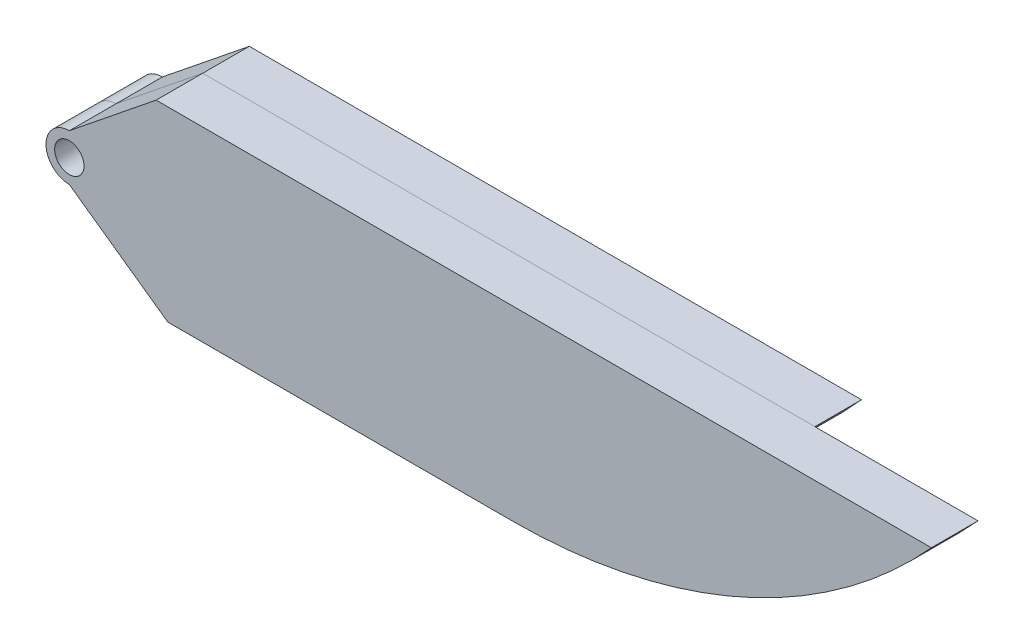
ISO-10303-21;
HEADER;
FILE_DESCRIPTION(('STEP AP214'),'2;1');
FILE_NAME('part.step','',(''),(''),'','','');
FILE_SCHEMA(('AUTOMOTIVE_DESIGN { 1 0 10303 214 1 1 1 1 }'));
ENDSEC;
DATA;
#1=APPLICATION_CONTEXT('core data for automotive mechanical design processes');
#2=APPLICATION_PROTOCOL_DEFINITION('international standard','automotive_design',2000,#1);
#3=PRODUCT_CONTEXT('',#1,'mechanical');
#4=PRODUCT('Part','Part','',(#3));
#5=PRODUCT_RELATED_PRODUCT_CATEGORY('part','',(#4));
#6=PRODUCT_DEFINITION_FORMATION('','',#4);
#7=PRODUCT_DEFINITION_CONTEXT('part definition',#1,'design');
#8=PRODUCT_DEFINITION('design','',#6,#7);
#9=PRODUCT_DEFINITION_SHAPE('','',#8);
#10=(LENGTH_UNIT() NAMED_UNIT(*) SI_UNIT(.MILLI.,.METRE.));
#11=(NAMED_UNIT(*) PLANE_ANGLE_UNIT() SI_UNIT($,.RADIAN.));
#12=(NAMED_UNIT(*) SI_UNIT($,.STERADIAN.) SOLID_ANGLE_UNIT());
#13=UNCERTAINTY_MEASURE_WITH_UNIT(LENGTH_MEASURE(1.E-05),#10,'distance_accuracy_value','');
#14=(GEOMETRIC_REPRESENTATION_CONTEXT(3) GLOBAL_UNCERTAINTY_ASSIGNED_CONTEXT((#13)) GLOBAL_UNIT_ASSIGNED_CONTEXT((#10,
#11,#12)) REPRESENTATION_CONTEXT('',''));
#15=CARTESIAN_POINT('',(0.,0.,0.));
#16=DIRECTION('',(0.,0.,1.));
#17=DIRECTION('',(1.,0.,0.));
#18=AXIS2_PLACEMENT_3D('',#15,#16,#17);
#19=CARTESIAN_POINT('',(-65.2393111860241,25.4,25.4));
#20=DIRECTION('',(0.627129883693703,-0.778914699423706,0.));
#21=DIRECTION('',(0.778914699423706,0.627129883693703,0.));
#22=AXIS2_PLACEMENT_3D('',#19,#20,#21);
#23=PLANE('',#22);
#24=DIRECTION('',(-0.778914699423706,-0.627129883693703,0.));
#25=VECTOR('',#24,1.);
#26=CARTESIAN_POINT('',(-65.2393111860241,25.4,12.7));
#27=LINE('',#26,#25);
#28=CARTESIAN_POINT('',(-65.2393111860241,25.4,12.7));
#29=VERTEX_POINT('',#28);
#30=CARTESIAN_POINT('',(-88.9,6.34999999999998,12.7));
#31=VERTEX_POINT('',#30);
#32=EDGE_CURVE('E148',#29,#31,#27,.T.);
#33=ORIENTED_EDGE('',*,*,#32,.T.);
#34=DIRECTION('',(0.,0.,-1.));
#35=VECTOR('',#34,1.);
#36=CARTESIAN_POINT('',(-88.9,6.34999999999998,25.4));
#37=LINE('',#36,#35);
#38=CARTESIAN_POINT('',(-88.9,6.34999999999998,25.4));
#39=VERTEX_POINT('',#38);
#40=EDGE_CURVE('E12',#39,#31,#37,.T.);
#41=ORIENTED_EDGE('',*,*,#40,.F.);
#42=DIRECTION('',(-0.778914699423706,-0.627129883693703,0.));
#43=VECTOR('',#42,1.);
#44=CARTESIAN_POINT('',(-65.2393111860241,25.4,25.4));
#45=LINE('',#44,#43);
#46=CARTESIAN_POINT('',(-65.2393111860241,25.4,25.4));
#47=VERTEX_POINT('',#46);
#48=EDGE_CURVE('E166',#47,#39,#45,.T.);
#49=ORIENTED_EDGE('',*,*,#48,.F.);
#50=DIRECTION('',(0.,0.,-1.));
#51=VECTOR('',#50,1.);
#52=CARTESIAN_POINT('',(-65.2393111860241,25.4,25.4));
#53=LINE('',#52,#51);
#54=EDGE_CURVE('E104',#47,#29,#53,.T.);
#55=ORIENTED_EDGE('',*,*,#54,.T.);
#56=EDGE_LOOP('',(#33,#41,#49,#55));
#57=FACE_BOUND('',#56,.T.);
#58=ADVANCED_FACE('F57',(#57),#23,.F.);
#59=CARTESIAN_POINT('',(-88.9,0.,25.4));
#60=DIRECTION('',(0.,0.,-1.));
#61=DIRECTION('',(-1.,0.,0.));
#62=AXIS2_PLACEMENT_3D('',#59,#60,#61);
#63=CYLINDRICAL_SURFACE('',#62,6.35);
#64=CARTESIAN_POINT('',(-88.9,0.,12.7));
#65=DIRECTION('',(0.,0.,1.));
#66=DIRECTION('',(1.,0.,0.));
#67=AXIS2_PLACEMENT_3D('',#64,#65,#66);
#68=CIRCLE('',#67,6.35);
#69=CARTESIAN_POINT('',(-88.8999999999999,-6.35000000000001,12.7));
#70=VERTEX_POINT('',#69);
#71=EDGE_CURVE('E151',#31,#70,#68,.T.);
#72=ORIENTED_EDGE('',*,*,#71,.T.);
#73=DIRECTION('',(0.,0.,-1.));
#74=VECTOR('',#73,1.);
#75=CARTESIAN_POINT('',(-88.8999999999999,-6.35000000000001,25.4));
#76=LINE('',#75,#74);
#77=CARTESIAN_POINT('',(-88.8999999999999,-6.35000000000001,25.4));
#78=VERTEX_POINT('',#77);
#79=EDGE_CURVE('E66',#78,#70,#76,.T.);
#80=ORIENTED_EDGE('',*,*,#79,.F.);
#81=CARTESIAN_POINT('',(-88.9,0.,25.4));
#82=DIRECTION('',(0.,0.,1.));
#83=DIRECTION('',(1.,0.,0.));
#84=AXIS2_PLACEMENT_3D('',#81,#82,#83);
#85=CIRCLE('',#84,6.35);
#86=EDGE_CURVE('E111',#39,#78,#85,.T.);
#87=ORIENTED_EDGE('',*,*,#86,.F.);
#88=ORIENTED_EDGE('',*,*,#40,.T.);
#89=EDGE_LOOP('',(#72,#80,#87,#88));
#90=FACE_BOUND('',#89,.T.);
#91=ADVANCED_FACE('F179',(#90),#63,.T.);
#92=CARTESIAN_POINT('',(-88.8999999999999,-6.35000000000001,25.4));
#93=DIRECTION('',(0.578593487027699,0.815616071916884,0.));
#94=DIRECTION('',(-0.815616071916884,0.578593487027699,0.));
#95=AXIS2_PLACEMENT_3D('',#92,#93,#94);
#96=PLANE('',#95);
#97=DIRECTION('',(0.815616071916884,-0.578593487027699,0.));
#98=VECTOR('',#97,1.);
#99=CARTESIAN_POINT('',(-88.8999999999999,-6.35000000000001,12.7));
#100=LINE('',#99,#98);
#101=CARTESIAN_POINT('',(-62.0461094561667,-25.4,12.7));
#102=VERTEX_POINT('',#101);
#103=EDGE_CURVE('E155',#70,#102,#100,.T.);
#104=ORIENTED_EDGE('',*,*,#103,.T.);
#105=DIRECTION('',(0.,0.,-1.));
#106=VECTOR('',#105,1.);
#107=CARTESIAN_POINT('',(-62.0461094561667,-25.4,25.4));
#108=LINE('',#107,#106);
#109=CARTESIAN_POINT('',(-62.0461094561667,-25.4,25.4));
#110=VERTEX_POINT('',#109);
#111=EDGE_CURVE('E138',#110,#102,#108,.T.);
#112=ORIENTED_EDGE('',*,*,#111,.F.);
#113=DIRECTION('',(0.815616071916884,-0.578593487027699,0.));
#114=VECTOR('',#113,1.);
#115=CARTESIAN_POINT('',(-88.8999999999999,-6.35000000000001,25.4));
#116=LINE('',#115,#114);
#117=EDGE_CURVE('E125',#78,#110,#116,.T.);
#118=ORIENTED_EDGE('',*,*,#117,.F.);
#119=ORIENTED_EDGE('',*,*,#79,.T.);
#120=EDGE_LOOP('',(#104,#112,#118,#119));
#121=FACE_BOUND('',#120,.T.);
#122=ADVANCED_FACE('F176',(#121),#96,.F.);
#123=CARTESIAN_POINT('',(0.,-25.4,25.4));
#124=DIRECTION('',(0.,1.,0.));
#125=DIRECTION('',(-1.,0.,0.));
#126=AXIS2_PLACEMENT_3D('',#123,#124,#125);
#127=PLANE('',#126);
#128=DIRECTION('',(1.,0.,0.));
#129=VECTOR('',#128,1.);
#130=CARTESIAN_POINT('',(0.,-25.4,12.7));
#131=LINE('',#130,#129);
#132=CARTESIAN_POINT('',(31.75,-25.4,12.7));
#133=VERTEX_POINT('',#132);
#134=EDGE_CURVE('E134',#102,#133,#131,.T.);
#135=ORIENTED_EDGE('',*,*,#134,.T.);
#136=DIRECTION('',(0.,0.,-1.));
#137=VECTOR('',#136,1.);
#138=CARTESIAN_POINT('',(31.75,-25.4,25.4));
#139=LINE('',#138,#137);
#140=CARTESIAN_POINT('',(31.75,-25.4,25.4));
#141=VERTEX_POINT('',#140);
#142=EDGE_CURVE('E132',#141,#133,#139,.T.);
#143=ORIENTED_EDGE('',*,*,#142,.F.);
#144=DIRECTION('',(1.,0.,0.));
#145=VECTOR('',#144,1.);
#146=CARTESIAN_POINT('',(-62.0461094561667,-25.4,25.4));
#147=LINE('',#146,#145);
#148=EDGE_CURVE('E118',#110,#141,#147,.T.);
#149=ORIENTED_EDGE('',*,*,#148,.F.);
#150=ORIENTED_EDGE('',*,*,#111,.T.);
#151=EDGE_LOOP('',(#135,#143,#149,#150));
#152=FACE_BOUND('',#151,.T.);
#153=ADVANCED_FACE('F133',(#152),#127,.F.);
#154=CARTESIAN_POINT('',(31.75,128.5875,25.4));
#155=DIRECTION('',(0.,0.,-1.));
#156=DIRECTION('',(-1.,0.,0.));
#157=AXIS2_PLACEMENT_3D('',#154,#155,#156);
#158=CYLINDRICAL_SURFACE('',#157,153.9875);
#159=CARTESIAN_POINT('',(31.75,128.5875,12.7));
#160=DIRECTION('',(0.,0.,1.));
#161=DIRECTION('',(1.,0.,0.));
#162=AXIS2_PLACEMENT_3D('',#159,#160,#161);
#163=CIRCLE('',#162,153.9875);
#164=CARTESIAN_POINT('',(146.05,25.4,12.7));
#165=VERTEX_POINT('',#164);
#166=EDGE_CURVE('E161',#133,#165,#163,.T.);
#167=ORIENTED_EDGE('',*,*,#166,.T.);
#168=DIRECTION('',(0.,0.,-1.));
#169=VECTOR('',#168,1.);
#170=CARTESIAN_POINT('',(146.05,25.4,25.4));
#171=LINE('',#170,#169);
#172=CARTESIAN_POINT('',(146.05,25.4,25.4));
#173=VERTEX_POINT('',#172);
#174=EDGE_CURVE('E139',#173,#165,#171,.T.);
#175=ORIENTED_EDGE('',*,*,#174,.F.);
#176=CARTESIAN_POINT('',(31.75,128.5875,25.4));
#177=DIRECTION('',(0.,0.,1.));
#178=DIRECTION('',(1.,0.,0.));
#179=AXIS2_PLACEMENT_3D('',#176,#177,#178);
#180=CIRCLE('',#179,153.9875);
#181=EDGE_CURVE('E122',#141,#173,#180,.T.);
#182=ORIENTED_EDGE('',*,*,#181,.F.);
#183=ORIENTED_EDGE('',*,*,#142,.T.);
#184=EDGE_LOOP('',(#167,#175,#182,#183));
#185=FACE_BOUND('',#184,.T.);
#186=ADVANCED_FACE('F141',(#185),#158,.T.);
#187=CARTESIAN_POINT('',(-65.2393111860241,25.4,25.4));
#188=DIRECTION('',(0.,1.,0.));
#189=DIRECTION('',(-1.,0.,0.));
#190=AXIS2_PLACEMENT_3D('',#187,#188,#189);
#191=PLANE('',#190);
#192=DIRECTION('',(1.,0.,0.));
#193=VECTOR('',#192,1.);
#194=CARTESIAN_POINT('',(-65.2393111860241,25.4,12.7));
#195=LINE('',#194,#193);
#196=EDGE_CURVE('E97',#29,#165,#195,.T.);
#197=ORIENTED_EDGE('',*,*,#196,.F.);
#198=ORIENTED_EDGE('',*,*,#54,.F.);
#199=DIRECTION('',(1.,0.,0.));
#200=VECTOR('',#199,1.);
#201=CARTESIAN_POINT('',(101.6,25.4,25.4));
#202=LINE('',#201,#200);
#203=EDGE_CURVE('E74',#47,#173,#202,.T.);
#204=ORIENTED_EDGE('',*,*,#203,.T.);
#205=ORIENTED_EDGE('',*,*,#174,.T.);
#206=EDGE_LOOP('',(#197,#198,#204,#205));
#207=FACE_BOUND('',#206,.T.);
#208=ADVANCED_FACE('F193',(#207),#191,.T.);
#209=CARTESIAN_POINT('',(-88.9,0.,25.4));
#210=DIRECTION('',(0.,0.,1.));
#211=DIRECTION('',(1.,0.,0.));
#212=AXIS2_PLACEMENT_3D('',#209,#210,#211);
#213=PLANE('',#212);
#214=CARTESIAN_POINT('',(-88.9,0.,25.4));
#215=DIRECTION('',(0.,0.,1.));
#216=DIRECTION('',(1.,0.,0.));
#217=AXIS2_PLACEMENT_3D('',#214,#215,#216);
#218=CIRCLE('',#217,4.00000000000001);
#219=CARTESIAN_POINT('',(-84.9,0.,25.4));
#220=VERTEX_POINT('',#219);
#221=EDGE_CURVE('E152',#220,#220,#218,.T.);
#222=ORIENTED_EDGE('',*,*,#221,.F.);
#223=EDGE_LOOP('',(#222));
#224=FACE_BOUND('',#223,.T.);
#225=ORIENTED_EDGE('',*,*,#48,.T.);
#226=ORIENTED_EDGE('',*,*,#86,.T.);
#227=ORIENTED_EDGE('',*,*,#117,.T.);
#228=ORIENTED_EDGE('',*,*,#148,.T.);
#229=ORIENTED_EDGE('',*,*,#181,.T.);
#230=ORIENTED_EDGE('',*,*,#203,.F.);
#231=EDGE_LOOP('',(#225,#226,#227,#228,#229,#230));
#232=FACE_BOUND('',#231,.T.);
#233=ADVANCED_FACE('F120',(#224,#232),#213,.T.);
#234=CARTESIAN_POINT('',(-88.9,0.,12.7));
#235=DIRECTION('',(0.,0.,1.));
#236=DIRECTION('',(1.,0.,0.));
#237=AXIS2_PLACEMENT_3D('',#234,#235,#236);
#238=PLANE('',#237);
#239=CARTESIAN_POINT('',(-88.9,0.,12.7));
#240=DIRECTION('',(0.,0.,1.));
#241=DIRECTION('',(1.,0.,0.));
#242=AXIS2_PLACEMENT_3D('',#239,#240,#241);
#243=CIRCLE('',#242,4.00000000000001);
#244=CARTESIAN_POINT('',(-84.9,0.,12.7));
#245=VERTEX_POINT('',#244);
#246=EDGE_CURVE('E213',#245,#245,#243,.T.);
#247=ORIENTED_EDGE('',*,*,#246,.T.);
#248=EDGE_LOOP('',(#247));
#249=FACE_BOUND('',#248,.T.);
#250=ORIENTED_EDGE('',*,*,#32,.F.);
#251=ORIENTED_EDGE('',*,*,#196,.T.);
#252=ORIENTED_EDGE('',*,*,#166,.F.);
#253=ORIENTED_EDGE('',*,*,#134,.F.);
#254=ORIENTED_EDGE('',*,*,#103,.F.);
#255=ORIENTED_EDGE('',*,*,#71,.F.);
#256=EDGE_LOOP('',(#250,#251,#252,#253,#254,#255));
#257=FACE_BOUND('',#256,.T.);
#258=ADVANCED_FACE('F177',(#249,#257),#238,.F.);
#259=CARTESIAN_POINT('',(-88.9,0.,25.4));
#260=DIRECTION('',(0.,0.,-1.));
#261=DIRECTION('',(-1.,0.,0.));
#262=AXIS2_PLACEMENT_3D('',#259,#260,#261);
#263=CYLINDRICAL_SURFACE('',#262,4.00000000000001);
#264=ORIENTED_EDGE('',*,*,#221,.T.);
#265=EDGE_LOOP('',(#264));
#266=FACE_BOUND('',#265,.T.);
#267=ORIENTED_EDGE('',*,*,#246,.F.);
#268=EDGE_LOOP('',(#267));
#269=FACE_BOUND('',#268,.T.);
#270=ADVANCED_FACE('F199',(#266,#269),#263,.F.);
#271=CLOSED_SHELL('',(#58,#91,#122,#153,#186,#208,#233,#258,#270));
#272=MANIFOLD_SOLID_BREP('B2',#271);
#273=CARTESIAN_POINT('',(101.6,-25.4,12.7));
#274=DIRECTION('',(0.,1.,0.));
#275=DIRECTION('',(-1.,0.,0.));
#276=AXIS2_PLACEMENT_3D('',#273,#274,#275);
#277=PLANE('',#276);
#278=DIRECTION('',(1.,0.,0.));
#279=VECTOR('',#278,1.);
#280=CARTESIAN_POINT('',(101.6,-25.4,0.));
#281=LINE('',#280,#279);
#282=CARTESIAN_POINT('',(-62.0461094561667,-25.4,0.));
#283=VERTEX_POINT('',#282);
#284=CARTESIAN_POINT('',(0.,-25.4,0.));
#285=VERTEX_POINT('',#284);
#286=EDGE_CURVE('E345',#283,#285,#281,.T.);
#287=ORIENTED_EDGE('',*,*,#286,.T.);
#288=DIRECTION('',(0.,0.,1.));
#289=VECTOR('',#288,1.);
#290=CARTESIAN_POINT('',(0.,-25.4,0.));
#291=LINE('',#290,#289);
#292=CARTESIAN_POINT('',(0.,-25.4,12.7));
#293=VERTEX_POINT('',#292);
#294=EDGE_CURVE('E293',#285,#293,#291,.T.);
#295=ORIENTED_EDGE('',*,*,#294,.T.);
#296=DIRECTION('',(1.,0.,0.));
#297=VECTOR('',#296,1.);
#298=CARTESIAN_POINT('',(101.6,-25.4,12.7));
#299=LINE('',#298,#297);
#300=CARTESIAN_POINT('',(-62.0461094561667,-25.4,12.7));
#301=VERTEX_POINT('',#300);
#302=EDGE_CURVE('E343',#301,#293,#299,.T.);
#303=ORIENTED_EDGE('',*,*,#302,.F.);
#304=DIRECTION('',(0.,0.,1.));
#305=VECTOR('',#304,1.);
#306=CARTESIAN_POINT('',(-62.0461094561667,-25.4,0.));
#307=LINE('',#306,#305);
#308=EDGE_CURVE('E382',#283,#301,#307,.T.);
#309=ORIENTED_EDGE('',*,*,#308,.F.);
#310=EDGE_LOOP('',(#287,#295,#303,#309));
#311=FACE_BOUND('',#310,.T.);
#312=ADVANCED_FACE('F279',(#311),#277,.F.);
#313=CARTESIAN_POINT('',(101.6,25.4,12.7));
#314=DIRECTION('',(0.,-1.,0.));
#315=DIRECTION('',(1.,0.,0.));
#316=AXIS2_PLACEMENT_3D('',#313,#314,#315);
#317=PLANE('',#316);
#318=DIRECTION('',(-1.,0.,0.));
#319=VECTOR('',#318,1.);
#320=CARTESIAN_POINT('',(101.6,25.4,0.));
#321=LINE('',#320,#319);
#322=CARTESIAN_POINT('',(101.6,25.4,0.));
#323=VERTEX_POINT('',#322);
#324=CARTESIAN_POINT('',(-65.2393111860241,25.4,0.));
#325=VERTEX_POINT('',#324);
#326=EDGE_CURVE('E353',#323,#325,#321,.T.);
#327=ORIENTED_EDGE('',*,*,#326,.T.);
#328=DIRECTION('',(0.,0.,1.));
#329=VECTOR('',#328,1.);
#330=CARTESIAN_POINT('',(-65.2393111860241,25.4,0.));
#331=LINE('',#330,#329);
#332=CARTESIAN_POINT('',(-65.2393111860241,25.4,12.7));
#333=VERTEX_POINT('',#332);
#334=EDGE_CURVE('E301',#325,#333,#331,.T.);
#335=ORIENTED_EDGE('',*,*,#334,.T.);
#336=DIRECTION('',(-1.,0.,0.));
#337=VECTOR('',#336,1.);
#338=CARTESIAN_POINT('',(101.6,25.4,12.7));
#339=LINE('',#338,#337);
#340=CARTESIAN_POINT('',(101.6,25.4,12.7));
#341=VERTEX_POINT('',#340);
#342=EDGE_CURVE('E286',#341,#333,#339,.T.);
#343=ORIENTED_EDGE('',*,*,#342,.F.);
#344=DIRECTION('',(0.,0.,-1.));
#345=VECTOR('',#344,1.);
#346=CARTESIAN_POINT('',(101.6,25.4,12.7));
#347=LINE('',#346,#345);
#348=EDGE_CURVE('E55',#341,#323,#347,.T.);
#349=ORIENTED_EDGE('',*,*,#348,.T.);
#350=EDGE_LOOP('',(#327,#335,#343,#349));
#351=FACE_BOUND('',#350,.T.);
#352=ADVANCED_FACE('F390',(#351),#317,.F.);
#353=CARTESIAN_POINT('',(0.,0.,12.7));
#354=DIRECTION('',(0.,0.,-1.));
#355=DIRECTION('',(-1.,0.,0.));
#356=AXIS2_PLACEMENT_3D('',#353,#354,#355);
#357=PLANE('',#356);
#358=CARTESIAN_POINT('',(-88.9,0.,12.7));
#359=DIRECTION('',(0.,0.,1.));
#360=DIRECTION('',(1.,0.,0.));
#361=AXIS2_PLACEMENT_3D('',#358,#359,#360);
#362=CIRCLE('',#361,4.00000000000001);
#363=CARTESIAN_POINT('',(-84.9,0.,12.7));
#364=VERTEX_POINT('',#363);
#365=EDGE_CURVE('E346',#364,#364,#362,.T.);
#366=ORIENTED_EDGE('',*,*,#365,.F.);
#367=EDGE_LOOP('',(#366));
#368=FACE_BOUND('',#367,.T.);
#369=ORIENTED_EDGE('',*,*,#302,.T.);
#370=CARTESIAN_POINT('',(-12.4454899577828,126.490979915565,12.7));
#371=DIRECTION('',(0.,0.,-1.));
#372=DIRECTION('',(1.,0.,0.));
#373=AXIS2_PLACEMENT_3D('',#370,#371,#372);
#374=CIRCLE('',#373,152.4);
#375=EDGE_CURVE('E330',#341,#293,#374,.T.);
#376=ORIENTED_EDGE('',*,*,#375,.F.);
#377=ORIENTED_EDGE('',*,*,#342,.T.);
#378=DIRECTION('',(0.778914699423706,0.627129883693703,0.));
#379=VECTOR('',#378,1.);
#380=CARTESIAN_POINT('',(-88.9,6.34999999999998,12.7));
#381=LINE('',#380,#379);
#382=CARTESIAN_POINT('',(-88.9,6.34999999999998,12.7));
#383=VERTEX_POINT('',#382);
#384=EDGE_CURVE('E377',#383,#333,#381,.T.);
#385=ORIENTED_EDGE('',*,*,#384,.F.);
#386=CARTESIAN_POINT('',(-88.9,0.,12.7));
#387=DIRECTION('',(0.,0.,-1.));
#388=DIRECTION('',(1.,0.,0.));
#389=AXIS2_PLACEMENT_3D('',#386,#387,#388);
#390=CIRCLE('',#389,6.35);
#391=CARTESIAN_POINT('',(-88.9,-6.35000000000001,12.7));
#392=VERTEX_POINT('',#391);
#393=EDGE_CURVE('E337',#392,#383,#390,.T.);
#394=ORIENTED_EDGE('',*,*,#393,.F.);
#395=DIRECTION('',(-0.815616071916885,0.578593487027698,0.));
#396=VECTOR('',#395,1.);
#397=CARTESIAN_POINT('',(-88.9,-6.35000000000001,12.7));
#398=LINE('',#397,#396);
#399=EDGE_CURVE('E352',#301,#392,#398,.T.);
#400=ORIENTED_EDGE('',*,*,#399,.F.);
#401=EDGE_LOOP('',(#369,#376,#377,#385,#394,#400));
#402=FACE_BOUND('',#401,.T.);
#403=ADVANCED_FACE('F349',(#368,#402),#357,.F.);
#404=CARTESIAN_POINT('',(0.,0.,0.));
#405=DIRECTION('',(0.,0.,-1.));
#406=DIRECTION('',(-1.,0.,0.));
#407=AXIS2_PLACEMENT_3D('',#404,#405,#406);
#408=PLANE('',#407);
#409=CARTESIAN_POINT('',(-12.4454899577828,126.490979915565,0.));
#410=DIRECTION('',(0.,0.,-1.));
#411=DIRECTION('',(1.,0.,0.));
#412=AXIS2_PLACEMENT_3D('',#409,#410,#411);
#413=CIRCLE('',#412,152.4);
#414=EDGE_CURVE('E336',#323,#285,#413,.T.);
#415=ORIENTED_EDGE('',*,*,#414,.T.);
#416=ORIENTED_EDGE('',*,*,#286,.F.);
#417=DIRECTION('',(-0.815616071916885,0.578593487027698,0.));
#418=VECTOR('',#417,1.);
#419=CARTESIAN_POINT('',(-88.9,-6.35000000000001,0.));
#420=LINE('',#419,#418);
#421=CARTESIAN_POINT('',(-88.9,-6.35000000000001,0.));
#422=VERTEX_POINT('',#421);
#423=EDGE_CURVE('E371',#283,#422,#420,.T.);
#424=ORIENTED_EDGE('',*,*,#423,.T.);
#425=CARTESIAN_POINT('',(-88.9,0.,0.));
#426=DIRECTION('',(0.,0.,-1.));
#427=DIRECTION('',(1.,0.,0.));
#428=AXIS2_PLACEMENT_3D('',#425,#426,#427);
#429=CIRCLE('',#428,6.35);
#430=CARTESIAN_POINT('',(-88.9,6.34999999999998,0.));
#431=VERTEX_POINT('',#430);
#432=EDGE_CURVE('E366',#422,#431,#429,.T.);
#433=ORIENTED_EDGE('',*,*,#432,.T.);
#434=DIRECTION('',(0.778914699423706,0.627129883693703,0.));
#435=VECTOR('',#434,1.);
#436=CARTESIAN_POINT('',(-88.9,6.34999999999998,0.));
#437=LINE('',#436,#435);
#438=EDGE_CURVE('E369',#431,#325,#437,.T.);
#439=ORIENTED_EDGE('',*,*,#438,.T.);
#440=ORIENTED_EDGE('',*,*,#326,.F.);
#441=EDGE_LOOP('',(#415,#416,#424,#433,#439,#440));
#442=FACE_BOUND('',#441,.T.);
#443=CARTESIAN_POINT('',(-88.9,0.,0.));
#444=DIRECTION('',(0.,0.,1.));
#445=DIRECTION('',(1.,0.,0.));
#446=AXIS2_PLACEMENT_3D('',#443,#444,#445);
#447=CIRCLE('',#446,4.00000000000001);
#448=CARTESIAN_POINT('',(-84.9,0.,0.));
#449=VERTEX_POINT('',#448);
#450=EDGE_CURVE('E360',#449,#449,#447,.T.);
#451=ORIENTED_EDGE('',*,*,#450,.T.);
#452=EDGE_LOOP('',(#451));
#453=FACE_BOUND('',#452,.T.);
#454=ADVANCED_FACE('F388',(#442,#453),#408,.T.);
#455=CARTESIAN_POINT('',(-88.9,0.,0.));
#456=DIRECTION('',(0.,0.,1.));
#457=DIRECTION('',(1.,0.,0.));
#458=AXIS2_PLACEMENT_3D('',#455,#456,#457);
#459=CYLINDRICAL_SURFACE('',#458,4.00000000000001);
#460=ORIENTED_EDGE('',*,*,#450,.F.);
#461=EDGE_LOOP('',(#460));
#462=FACE_BOUND('',#461,.T.);
#463=ORIENTED_EDGE('',*,*,#365,.T.);
#464=EDGE_LOOP('',(#463));
#465=FACE_BOUND('',#464,.T.);
#466=ADVANCED_FACE('F405',(#462,#465),#459,.F.);
#467=CARTESIAN_POINT('',(-88.9,0.,0.));
#468=DIRECTION('',(0.,0.,1.));
#469=DIRECTION('',(1.,0.,0.));
#470=AXIS2_PLACEMENT_3D('',#467,#468,#469);
#471=CYLINDRICAL_SURFACE('',#470,6.35);
#472=ORIENTED_EDGE('',*,*,#393,.T.);
#473=DIRECTION('',(0.,0.,1.));
#474=VECTOR('',#473,1.);
#475=CARTESIAN_POINT('',(-88.9,6.34999999999998,0.));
#476=LINE('',#475,#474);
#477=EDGE_CURVE('E374',#431,#383,#476,.T.);
#478=ORIENTED_EDGE('',*,*,#477,.F.);
#479=ORIENTED_EDGE('',*,*,#432,.F.);
#480=DIRECTION('',(0.,0.,1.));
#481=VECTOR('',#480,1.);
#482=CARTESIAN_POINT('',(-88.9,-6.35000000000001,0.));
#483=LINE('',#482,#481);
#484=EDGE_CURVE('E380',#422,#392,#483,.T.);
#485=ORIENTED_EDGE('',*,*,#484,.T.);
#486=EDGE_LOOP('',(#472,#478,#479,#485));
#487=FACE_BOUND('',#486,.T.);
#488=ADVANCED_FACE('F395',(#487),#471,.T.);
#489=CARTESIAN_POINT('',(-88.9,-6.35000000000001,0.));
#490=DIRECTION('',(0.578593487027698,0.815616071916885,0.));
#491=DIRECTION('',(-0.815616071916885,0.578593487027698,0.));
#492=AXIS2_PLACEMENT_3D('',#489,#490,#491);
#493=PLANE('',#492);
#494=ORIENTED_EDGE('',*,*,#399,.T.);
#495=ORIENTED_EDGE('',*,*,#484,.F.);
#496=ORIENTED_EDGE('',*,*,#423,.F.);
#497=ORIENTED_EDGE('',*,*,#308,.T.);
#498=EDGE_LOOP('',(#494,#495,#496,#497));
#499=FACE_BOUND('',#498,.T.);
#500=ADVANCED_FACE('F397',(#499),#493,.F.);
#501=CARTESIAN_POINT('',(-88.9,6.34999999999998,0.));
#502=DIRECTION('',(0.627129883693703,-0.778914699423706,0.));
#503=DIRECTION('',(0.778914699423706,0.627129883693703,0.));
#504=AXIS2_PLACEMENT_3D('',#501,#502,#503);
#505=PLANE('',#504);
#506=ORIENTED_EDGE('',*,*,#384,.T.);
#507=ORIENTED_EDGE('',*,*,#334,.F.);
#508=ORIENTED_EDGE('',*,*,#438,.F.);
#509=ORIENTED_EDGE('',*,*,#477,.T.);
#510=EDGE_LOOP('',(#506,#507,#508,#509));
#511=FACE_BOUND('',#510,.T.);
#512=ADVANCED_FACE('F392',(#511),#505,.F.);
#513=CARTESIAN_POINT('',(-12.4454899577828,126.490979915565,0.));
#514=DIRECTION('',(0.,0.,1.));
#515=DIRECTION('',(1.,0.,0.));
#516=AXIS2_PLACEMENT_3D('',#513,#514,#515);
#517=CYLINDRICAL_SURFACE('',#516,152.4);
#518=ORIENTED_EDGE('',*,*,#375,.T.);
#519=ORIENTED_EDGE('',*,*,#294,.F.);
#520=ORIENTED_EDGE('',*,*,#414,.F.);
#521=ORIENTED_EDGE('',*,*,#348,.F.);
#522=EDGE_LOOP('',(#518,#519,#520,#521));
#523=FACE_BOUND('',#522,.T.);
#524=ADVANCED_FACE('F331',(#523),#517,.T.);
#525=CLOSED_SHELL('',(#312,#352,#403,#454,#466,#488,#500,#512,#524));
#526=MANIFOLD_SOLID_BREP('B6_NOT_SHOWN',#525);
#527=ADVANCED_BREP_SHAPE_REPRESENTATION('',(#18,#272,#526),#14);
#528=SHAPE_DEFINITION_REPRESENTATION(#9,#527);
ENDSEC;
END-ISO-10303-21;
